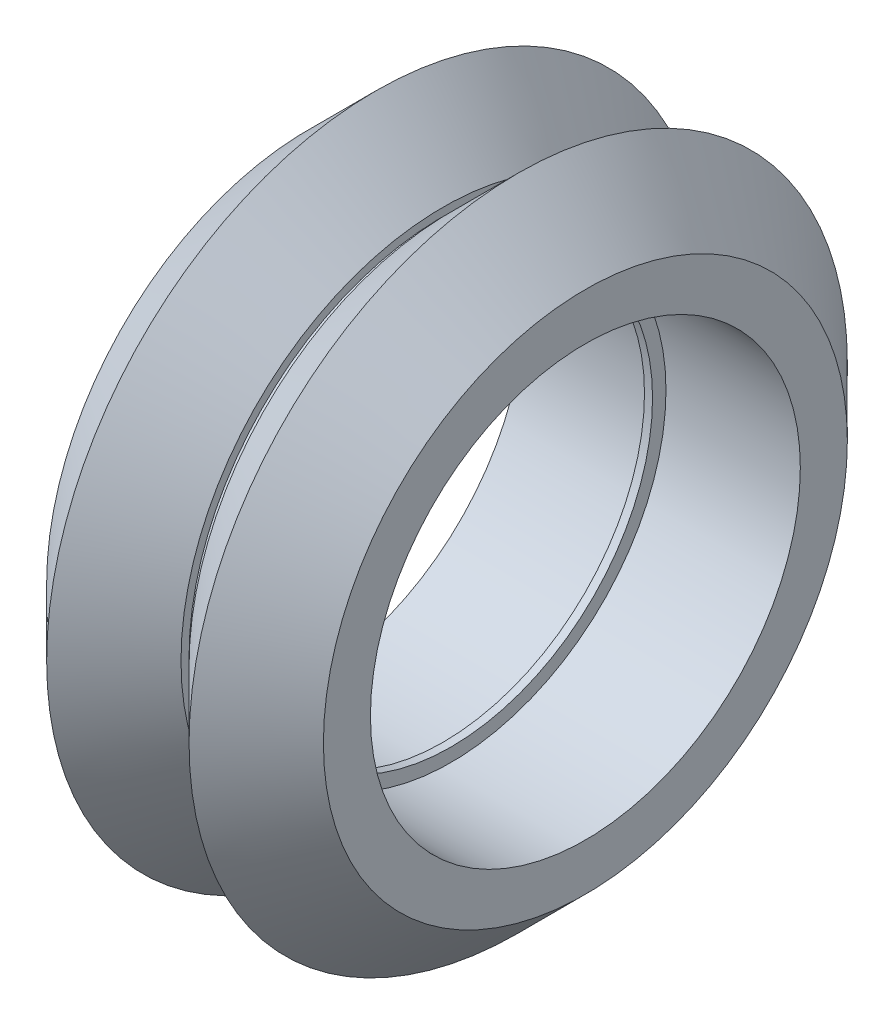
ISO-10303-21;
HEADER;
FILE_DESCRIPTION(('STEP AP214'),'2;1');
FILE_NAME('part.step','',(''),(''),'','','');
FILE_SCHEMA(('AUTOMOTIVE_DESIGN { 1 0 10303 214 1 1 1 1 }'));
ENDSEC;
DATA;
#1=APPLICATION_CONTEXT('core data for automotive mechanical design processes');
#2=APPLICATION_PROTOCOL_DEFINITION('international standard','automotive_design',2000,#1);
#3=PRODUCT_CONTEXT('',#1,'mechanical');
#4=PRODUCT('Part','Part','',(#3));
#5=PRODUCT_RELATED_PRODUCT_CATEGORY('part','',(#4));
#6=PRODUCT_DEFINITION_FORMATION('','',#4);
#7=PRODUCT_DEFINITION_CONTEXT('part definition',#1,'design');
#8=PRODUCT_DEFINITION('design','',#6,#7);
#9=PRODUCT_DEFINITION_SHAPE('','',#8);
#10=(LENGTH_UNIT() NAMED_UNIT(*) SI_UNIT(.MILLI.,.METRE.));
#11=(NAMED_UNIT(*) PLANE_ANGLE_UNIT() SI_UNIT($,.RADIAN.));
#12=(NAMED_UNIT(*) SI_UNIT($,.STERADIAN.) SOLID_ANGLE_UNIT());
#13=UNCERTAINTY_MEASURE_WITH_UNIT(LENGTH_MEASURE(1.E-05),#10,'distance_accuracy_value','');
#14=(GEOMETRIC_REPRESENTATION_CONTEXT(3) GLOBAL_UNCERTAINTY_ASSIGNED_CONTEXT((#13)) GLOBAL_UNIT_ASSIGNED_CONTEXT((#10,
#11,#12)) REPRESENTATION_CONTEXT('',''));
#15=CARTESIAN_POINT('',(0.,0.,0.));
#16=DIRECTION('',(0.,0.,1.));
#17=DIRECTION('',(1.,0.,0.));
#18=AXIS2_PLACEMENT_3D('',#15,#16,#17);
#19=CARTESIAN_POINT('',(-2.65000000000001,0.,0.));
#20=DIRECTION('',(1.,0.,0.));
#21=DIRECTION('',(0.,0.,-1.));
#22=AXIS2_PLACEMENT_3D('',#19,#20,#21);
#23=CONICAL_SURFACE('',#22,12.25,0.78539816339745);
#24=CARTESIAN_POINT('',(-5.15,0.,0.));
#25=DIRECTION('',(-1.,0.,0.));
#26=DIRECTION('',(0.,0.,1.));
#27=AXIS2_PLACEMENT_3D('',#24,#25,#26);
#28=CIRCLE('',#27,9.75);
#29=CARTESIAN_POINT('',(-5.15,0.,9.75));
#30=VERTEX_POINT('',#29);
#31=EDGE_CURVE('E59',#30,#30,#28,.T.);
#32=ORIENTED_EDGE('',*,*,#31,.F.);
#33=EDGE_LOOP('',(#32));
#34=FACE_BOUND('',#33,.T.);
#35=CARTESIAN_POINT('',(-2.65000000000001,0.,0.));
#36=DIRECTION('',(-1.,0.,0.));
#37=DIRECTION('',(0.,0.,1.));
#38=AXIS2_PLACEMENT_3D('',#35,#36,#37);
#39=CIRCLE('',#38,12.25);
#40=CARTESIAN_POINT('',(-2.65000000000001,0.,12.25));
#41=VERTEX_POINT('',#40);
#42=EDGE_CURVE('E10',#41,#41,#39,.T.);
#43=ORIENTED_EDGE('',*,*,#42,.T.);
#44=EDGE_LOOP('',(#43));
#45=FACE_BOUND('',#44,.T.);
#46=ADVANCED_FACE('F31',(#34,#45),#23,.T.);
#47=CARTESIAN_POINT('',(-0.150000000000018,0.,0.));
#48=DIRECTION('',(-1.,0.,0.));
#49=DIRECTION('',(0.,0.,1.));
#50=AXIS2_PLACEMENT_3D('',#47,#48,#49);
#51=CONICAL_SURFACE('',#50,9.75,0.78539816339745);
#52=ORIENTED_EDGE('',*,*,#42,.F.);
#53=EDGE_LOOP('',(#52));
#54=FACE_BOUND('',#53,.T.);
#55=CARTESIAN_POINT('',(-0.150000000000018,0.,0.));
#56=DIRECTION('',(-1.,0.,0.));
#57=DIRECTION('',(0.,0.,1.));
#58=AXIS2_PLACEMENT_3D('',#55,#56,#57);
#59=CIRCLE('',#58,9.75);
#60=CARTESIAN_POINT('',(-0.150000000000018,0.,9.75));
#61=VERTEX_POINT('',#60);
#62=EDGE_CURVE('E37',#61,#61,#59,.T.);
#63=ORIENTED_EDGE('',*,*,#62,.T.);
#64=EDGE_LOOP('',(#63));
#65=FACE_BOUND('',#64,.T.);
#66=ADVANCED_FACE('F106',(#54,#65),#51,.T.);
#67=CARTESIAN_POINT('',(-0.150000000000017,9.75,0.));
#68=DIRECTION('',(-1.,0.,0.));
#69=DIRECTION('',(0.,0.,1.));
#70=AXIS2_PLACEMENT_3D('',#67,#68,#69);
#71=PLANE('',#70);
#72=ORIENTED_EDGE('',*,*,#62,.F.);
#73=EDGE_LOOP('',(#72));
#74=FACE_BOUND('',#73,.T.);
#75=CARTESIAN_POINT('',(-0.150000000000016,0.,0.));
#76=DIRECTION('',(-1.,0.,0.));
#77=DIRECTION('',(0.,0.,1.));
#78=AXIS2_PLACEMENT_3D('',#75,#76,#77);
#79=CIRCLE('',#78,9.44999999999997);
#80=CARTESIAN_POINT('',(-0.150000000000016,0.,9.44999999999997));
#81=VERTEX_POINT('',#80);
#82=EDGE_CURVE('E41',#81,#81,#79,.T.);
#83=ORIENTED_EDGE('',*,*,#82,.T.);
#84=EDGE_LOOP('',(#83));
#85=FACE_BOUND('',#84,.T.);
#86=ADVANCED_FACE('F110',(#74,#85),#71,.F.);
#87=CARTESIAN_POINT('',(-5.77388535031847,0.,0.));
#88=DIRECTION('',(-1.,0.,0.));
#89=DIRECTION('',(0.,0.,1.));
#90=AXIS2_PLACEMENT_3D('',#87,#88,#89);
#91=CYLINDRICAL_SURFACE('',#90,9.44999999999997);
#92=ORIENTED_EDGE('',*,*,#82,.F.);
#93=EDGE_LOOP('',(#92));
#94=FACE_BOUND('',#93,.T.);
#95=CARTESIAN_POINT('',(0.150000000000016,0.,0.));
#96=DIRECTION('',(-1.,0.,0.));
#97=DIRECTION('',(0.,0.,1.));
#98=AXIS2_PLACEMENT_3D('',#95,#96,#97);
#99=CIRCLE('',#98,9.44999999999997);
#100=CARTESIAN_POINT('',(0.150000000000016,0.,9.44999999999997));
#101=VERTEX_POINT('',#100);
#102=EDGE_CURVE('E45',#101,#101,#99,.T.);
#103=ORIENTED_EDGE('',*,*,#102,.T.);
#104=EDGE_LOOP('',(#103));
#105=FACE_BOUND('',#104,.T.);
#106=ADVANCED_FACE('F115',(#94,#105),#91,.T.);
#107=CARTESIAN_POINT('',(0.150000000000015,9.44999999999997,0.));
#108=DIRECTION('',(1.,0.,0.));
#109=DIRECTION('',(0.,0.,-1.));
#110=AXIS2_PLACEMENT_3D('',#107,#108,#109);
#111=PLANE('',#110);
#112=ORIENTED_EDGE('',*,*,#102,.F.);
#113=EDGE_LOOP('',(#112));
#114=FACE_BOUND('',#113,.T.);
#115=CARTESIAN_POINT('',(0.150000000000013,0.,0.));
#116=DIRECTION('',(-1.,0.,0.));
#117=DIRECTION('',(0.,0.,1.));
#118=AXIS2_PLACEMENT_3D('',#115,#116,#117);
#119=CIRCLE('',#118,9.75);
#120=CARTESIAN_POINT('',(0.150000000000013,0.,9.75));
#121=VERTEX_POINT('',#120);
#122=EDGE_CURVE('E50',#121,#121,#119,.T.);
#123=ORIENTED_EDGE('',*,*,#122,.T.);
#124=EDGE_LOOP('',(#123));
#125=FACE_BOUND('',#124,.T.);
#126=ADVANCED_FACE('F121',(#114,#125),#111,.F.);
#127=CARTESIAN_POINT('',(2.65,0.,0.));
#128=DIRECTION('',(1.,0.,0.));
#129=DIRECTION('',(0.,0.,-1.));
#130=AXIS2_PLACEMENT_3D('',#127,#128,#129);
#131=CONICAL_SURFACE('',#130,12.25,0.78539816339745);
#132=ORIENTED_EDGE('',*,*,#122,.F.);
#133=EDGE_LOOP('',(#132));
#134=FACE_BOUND('',#133,.T.);
#135=CARTESIAN_POINT('',(2.65,0.,0.));
#136=DIRECTION('',(-1.,0.,0.));
#137=DIRECTION('',(0.,0.,1.));
#138=AXIS2_PLACEMENT_3D('',#135,#136,#137);
#139=CIRCLE('',#138,12.25);
#140=CARTESIAN_POINT('',(2.65,0.,12.25));
#141=VERTEX_POINT('',#140);
#142=EDGE_CURVE('E53',#141,#141,#139,.T.);
#143=ORIENTED_EDGE('',*,*,#142,.T.);
#144=EDGE_LOOP('',(#143));
#145=FACE_BOUND('',#144,.T.);
#146=ADVANCED_FACE('F125',(#134,#145),#131,.T.);
#147=CARTESIAN_POINT('',(5.15,0.,0.));
#148=DIRECTION('',(-1.,0.,0.));
#149=DIRECTION('',(0.,0.,1.));
#150=AXIS2_PLACEMENT_3D('',#147,#148,#149);
#151=CONICAL_SURFACE('',#150,9.75,0.785398163397449);
#152=ORIENTED_EDGE('',*,*,#142,.F.);
#153=EDGE_LOOP('',(#152));
#154=FACE_BOUND('',#153,.T.);
#155=CARTESIAN_POINT('',(5.15,0.,0.));
#156=DIRECTION('',(-1.,0.,0.));
#157=DIRECTION('',(0.,0.,1.));
#158=AXIS2_PLACEMENT_3D('',#155,#156,#157);
#159=CIRCLE('',#158,9.75);
#160=CARTESIAN_POINT('',(5.15,0.,9.75));
#161=VERTEX_POINT('',#160);
#162=EDGE_CURVE('E56',#161,#161,#159,.T.);
#163=ORIENTED_EDGE('',*,*,#162,.T.);
#164=EDGE_LOOP('',(#163));
#165=FACE_BOUND('',#164,.T.);
#166=ADVANCED_FACE('F129',(#154,#165),#151,.T.);
#167=CARTESIAN_POINT('',(5.15,2.5,0.));
#168=DIRECTION('',(-1.,0.,0.));
#169=DIRECTION('',(0.,0.,1.));
#170=AXIS2_PLACEMENT_3D('',#167,#168,#169);
#171=PLANE('',#170);
#172=CARTESIAN_POINT('',(5.15,0.,0.));
#173=DIRECTION('',(1.,0.,0.));
#174=DIRECTION('',(0.,0.,-1.));
#175=AXIS2_PLACEMENT_3D('',#172,#173,#174);
#176=CIRCLE('',#175,8.);
#177=CARTESIAN_POINT('',(5.15,0.,-8.));
#178=VERTEX_POINT('',#177);
#179=EDGE_CURVE('E63',#178,#178,#176,.T.);
#180=ORIENTED_EDGE('',*,*,#179,.F.);
#181=EDGE_LOOP('',(#180));
#182=FACE_BOUND('',#181,.T.);
#183=ORIENTED_EDGE('',*,*,#162,.F.);
#184=EDGE_LOOP('',(#183));
#185=FACE_BOUND('',#184,.T.);
#186=ADVANCED_FACE('F101',(#182,#185),#171,.F.);
#187=CARTESIAN_POINT('',(-5.15,2.5,0.));
#188=DIRECTION('',(1.,0.,0.));
#189=DIRECTION('',(0.,0.,-1.));
#190=AXIS2_PLACEMENT_3D('',#187,#188,#189);
#191=PLANE('',#190);
#192=CARTESIAN_POINT('',(-5.15,0.,0.));
#193=DIRECTION('',(-1.,0.,0.));
#194=DIRECTION('',(0.,0.,1.));
#195=AXIS2_PLACEMENT_3D('',#192,#193,#194);
#196=CIRCLE('',#195,8.);
#197=CARTESIAN_POINT('',(-5.15,0.,8.));
#198=VERTEX_POINT('',#197);
#199=EDGE_CURVE('E69',#198,#198,#196,.T.);
#200=ORIENTED_EDGE('',*,*,#199,.F.);
#201=EDGE_LOOP('',(#200));
#202=FACE_BOUND('',#201,.T.);
#203=ORIENTED_EDGE('',*,*,#31,.T.);
#204=EDGE_LOOP('',(#203));
#205=FACE_BOUND('',#204,.T.);
#206=ADVANCED_FACE('F97',(#202,#205),#191,.F.);
#207=CARTESIAN_POINT('',(0.15,0.,0.));
#208=DIRECTION('',(1.,0.,0.));
#209=DIRECTION('',(0.,0.,-1.));
#210=AXIS2_PLACEMENT_3D('',#207,#208,#209);
#211=PLANE('',#210);
#212=CARTESIAN_POINT('',(0.150000000000001,0.,0.));
#213=DIRECTION('',(1.,0.,0.));
#214=DIRECTION('',(0.,0.,-1.));
#215=AXIS2_PLACEMENT_3D('',#212,#213,#214);
#216=CIRCLE('',#215,7.5);
#217=CARTESIAN_POINT('',(0.150000000000001,0.,-7.5));
#218=VERTEX_POINT('',#217);
#219=EDGE_CURVE('E72',#218,#218,#216,.F.);
#220=ORIENTED_EDGE('',*,*,#219,.T.);
#221=EDGE_LOOP('',(#220));
#222=FACE_BOUND('',#221,.T.);
#223=CARTESIAN_POINT('',(0.15,0.,0.));
#224=DIRECTION('',(1.,0.,0.));
#225=DIRECTION('',(0.,0.,-1.));
#226=AXIS2_PLACEMENT_3D('',#223,#224,#225);
#227=CIRCLE('',#226,8.);
#228=CARTESIAN_POINT('',(0.15,0.,-8.));
#229=VERTEX_POINT('',#228);
#230=EDGE_CURVE('E62',#229,#229,#227,.T.);
#231=ORIENTED_EDGE('',*,*,#230,.T.);
#232=EDGE_LOOP('',(#231));
#233=FACE_BOUND('',#232,.T.);
#234=ADVANCED_FACE('F100',(#222,#233),#211,.T.);
#235=CARTESIAN_POINT('',(0.15,0.,0.));
#236=DIRECTION('',(1.,0.,0.));
#237=DIRECTION('',(0.,0.,-1.));
#238=AXIS2_PLACEMENT_3D('',#235,#236,#237);
#239=CYLINDRICAL_SURFACE('',#238,8.);
#240=ORIENTED_EDGE('',*,*,#230,.F.);
#241=EDGE_LOOP('',(#240));
#242=FACE_BOUND('',#241,.T.);
#243=ORIENTED_EDGE('',*,*,#179,.T.);
#244=EDGE_LOOP('',(#243));
#245=FACE_BOUND('',#244,.T.);
#246=ADVANCED_FACE('F88',(#242,#245),#239,.F.);
#247=CARTESIAN_POINT('',(-0.15,0.,0.));
#248=DIRECTION('',(-1.,0.,0.));
#249=DIRECTION('',(0.,0.,1.));
#250=AXIS2_PLACEMENT_3D('',#247,#248,#249);
#251=PLANE('',#250);
#252=CARTESIAN_POINT('',(-0.15,0.,0.));
#253=DIRECTION('',(-1.,0.,0.));
#254=DIRECTION('',(0.,0.,1.));
#255=AXIS2_PLACEMENT_3D('',#252,#253,#254);
#256=CIRCLE('',#255,7.5);
#257=CARTESIAN_POINT('',(-0.15,0.,7.5));
#258=VERTEX_POINT('',#257);
#259=EDGE_CURVE('E77',#258,#258,#256,.T.);
#260=ORIENTED_EDGE('',*,*,#259,.F.);
#261=EDGE_LOOP('',(#260));
#262=FACE_BOUND('',#261,.T.);
#263=CARTESIAN_POINT('',(-0.15,0.,0.));
#264=DIRECTION('',(-1.,0.,0.));
#265=DIRECTION('',(0.,0.,1.));
#266=AXIS2_PLACEMENT_3D('',#263,#264,#265);
#267=CIRCLE('',#266,8.);
#268=CARTESIAN_POINT('',(-0.15,0.,8.));
#269=VERTEX_POINT('',#268);
#270=EDGE_CURVE('E66',#269,#269,#267,.T.);
#271=ORIENTED_EDGE('',*,*,#270,.T.);
#272=EDGE_LOOP('',(#271));
#273=FACE_BOUND('',#272,.T.);
#274=ADVANCED_FACE('F84',(#262,#273),#251,.T.);
#275=CARTESIAN_POINT('',(-0.15,0.,0.));
#276=DIRECTION('',(-1.,0.,0.));
#277=DIRECTION('',(0.,0.,1.));
#278=AXIS2_PLACEMENT_3D('',#275,#276,#277);
#279=CYLINDRICAL_SURFACE('',#278,8.);
#280=ORIENTED_EDGE('',*,*,#270,.F.);
#281=EDGE_LOOP('',(#280));
#282=FACE_BOUND('',#281,.T.);
#283=ORIENTED_EDGE('',*,*,#199,.T.);
#284=EDGE_LOOP('',(#283));
#285=FACE_BOUND('',#284,.T.);
#286=ADVANCED_FACE('F87',(#282,#285),#279,.F.);
#287=CARTESIAN_POINT('',(21.3632034355964,0.,0.));
#288=DIRECTION('',(-1.,0.,0.));
#289=DIRECTION('',(0.,0.,1.));
#290=AXIS2_PLACEMENT_3D('',#287,#288,#289);
#291=CYLINDRICAL_SURFACE('',#290,7.5);
#292=ORIENTED_EDGE('',*,*,#259,.T.);
#293=EDGE_LOOP('',(#292));
#294=FACE_BOUND('',#293,.T.);
#295=ORIENTED_EDGE('',*,*,#219,.F.);
#296=EDGE_LOOP('',(#295));
#297=FACE_BOUND('',#296,.T.);
#298=ADVANCED_FACE('F81',(#294,#297),#291,.F.);
#299=CLOSED_SHELL('',(#46,#66,#86,#106,#126,#146,#166,#186,#206,#234,#246,#274,#286,#298));
#300=MANIFOLD_SOLID_BREP('B2',#299);
#301=ADVANCED_BREP_SHAPE_REPRESENTATION('',(#18,#300),#14);
#302=SHAPE_DEFINITION_REPRESENTATION(#9,#301);
ENDSEC;
END-ISO-10303-21;
